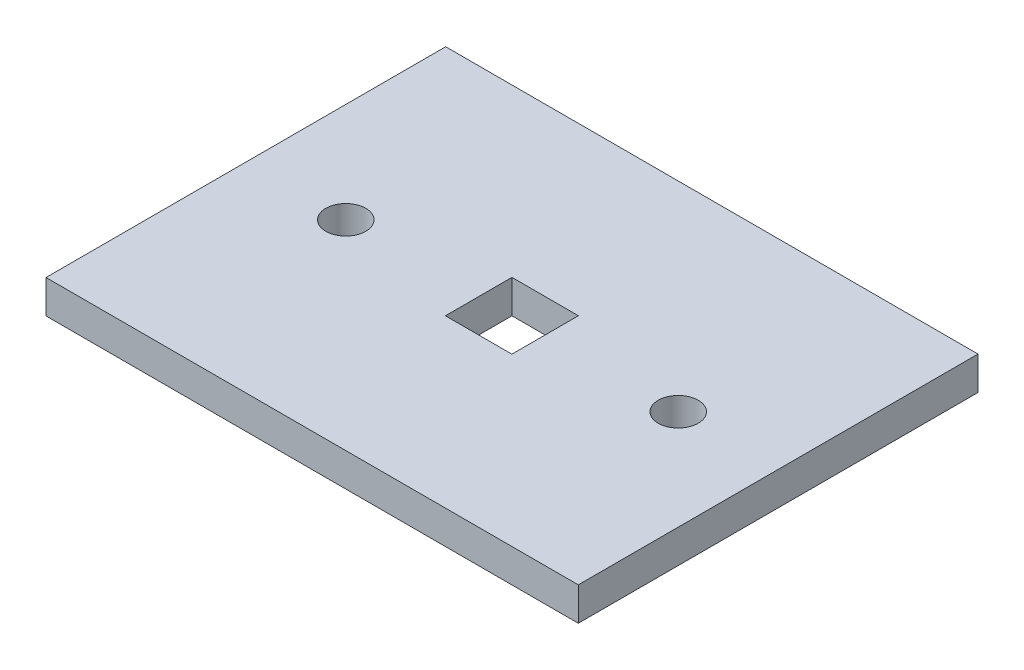
ISO-10303-21;
HEADER;
FILE_DESCRIPTION(('STEP AP214'),'2;1');
FILE_NAME('part.step','',(''),(''),'','','');
FILE_SCHEMA(('AUTOMOTIVE_DESIGN { 1 0 10303 214 1 1 1 1 }'));
ENDSEC;
DATA;
#1=APPLICATION_CONTEXT('core data for automotive mechanical design processes');
#2=APPLICATION_PROTOCOL_DEFINITION('international standard','automotive_design',2000,#1);
#3=PRODUCT_CONTEXT('',#1,'mechanical');
#4=PRODUCT('Part','Part','',(#3));
#5=PRODUCT_RELATED_PRODUCT_CATEGORY('part','',(#4));
#6=PRODUCT_DEFINITION_FORMATION('','',#4);
#7=PRODUCT_DEFINITION_CONTEXT('part definition',#1,'design');
#8=PRODUCT_DEFINITION('design','',#6,#7);
#9=PRODUCT_DEFINITION_SHAPE('','',#8);
#10=(LENGTH_UNIT() NAMED_UNIT(*) SI_UNIT(.MILLI.,.METRE.));
#11=(NAMED_UNIT(*) PLANE_ANGLE_UNIT() SI_UNIT($,.RADIAN.));
#12=(NAMED_UNIT(*) SI_UNIT($,.STERADIAN.) SOLID_ANGLE_UNIT());
#13=UNCERTAINTY_MEASURE_WITH_UNIT(LENGTH_MEASURE(1.E-05),#10,'distance_accuracy_value','');
#14=(GEOMETRIC_REPRESENTATION_CONTEXT(3) GLOBAL_UNCERTAINTY_ASSIGNED_CONTEXT((#13)) GLOBAL_UNIT_ASSIGNED_CONTEXT((#10,
#11,#12)) REPRESENTATION_CONTEXT('',''));
#15=CARTESIAN_POINT('',(0.,0.,0.));
#16=DIRECTION('',(0.,0.,1.));
#17=DIRECTION('',(1.,0.,0.));
#18=AXIS2_PLACEMENT_3D('',#15,#16,#17);
#19=CARTESIAN_POINT('',(0.,10.,0.));
#20=DIRECTION('',(0.,1.,0.));
#21=DIRECTION('',(0.,0.,1.));
#22=AXIS2_PLACEMENT_3D('',#19,#20,#21);
#23=PLANE('',#22);
#24=CARTESIAN_POINT('',(-15.5121951219512,10.,22.2439024390244));
#25=DIRECTION('',(0.,1.,0.));
#26=DIRECTION('',(0.,0.,1.));
#27=AXIS2_PLACEMENT_3D('',#24,#25,#26);
#28=CIRCLE('',#27,6.);
#29=CARTESIAN_POINT('',(-15.5121951219512,10.,28.2439024390244));
#30=VERTEX_POINT('',#29);
#31=EDGE_CURVE('E197',#30,#30,#28,.T.);
#32=ORIENTED_EDGE('',*,*,#31,.F.);
#33=EDGE_LOOP('',(#32));
#34=FACE_BOUND('',#33,.T.);
#35=CARTESIAN_POINT('',(84.2926829268293,10.,22.2439024390244));
#36=DIRECTION('',(0.,1.,0.));
#37=DIRECTION('',(0.,0.,1.));
#38=AXIS2_PLACEMENT_3D('',#35,#36,#37);
#39=CIRCLE('',#38,6.);
#40=CARTESIAN_POINT('',(84.2926829268293,10.,28.2439024390244));
#41=VERTEX_POINT('',#40);
#42=EDGE_CURVE('E133',#41,#41,#39,.T.);
#43=ORIENTED_EDGE('',*,*,#42,.F.);
#44=EDGE_LOOP('',(#43));
#45=FACE_BOUND('',#44,.T.);
#46=DIRECTION('',(0.,0.,-1.));
#47=VECTOR('',#46,1.);
#48=CARTESIAN_POINT('',(114.292682926829,10.,82.2439024390244));
#49=LINE('',#48,#47);
#50=CARTESIAN_POINT('',(114.292682926829,10.,82.2439024390244));
#51=VERTEX_POINT('',#50);
#52=CARTESIAN_POINT('',(114.292682926829,10.,-37.7560975609756));
#53=VERTEX_POINT('',#52);
#54=EDGE_CURVE('E147',#51,#53,#49,.T.);
#55=ORIENTED_EDGE('',*,*,#54,.T.);
#56=DIRECTION('',(-1.,0.,0.));
#57=VECTOR('',#56,1.);
#58=CARTESIAN_POINT('',(114.292682926829,10.,-37.7560975609756));
#59=LINE('',#58,#57);
#60=CARTESIAN_POINT('',(-45.5121951219512,10.,-37.7560975609756));
#61=VERTEX_POINT('',#60);
#62=EDGE_CURVE('E151',#53,#61,#59,.T.);
#63=ORIENTED_EDGE('',*,*,#62,.T.);
#64=DIRECTION('',(0.,0.,1.));
#65=VECTOR('',#64,1.);
#66=CARTESIAN_POINT('',(-45.5121951219512,10.,-37.7560975609756));
#67=LINE('',#66,#65);
#68=CARTESIAN_POINT('',(-45.5121951219512,10.,82.2439024390244));
#69=VERTEX_POINT('',#68);
#70=EDGE_CURVE('E155',#61,#69,#67,.T.);
#71=ORIENTED_EDGE('',*,*,#70,.T.);
#72=DIRECTION('',(1.,0.,0.));
#73=VECTOR('',#72,1.);
#74=CARTESIAN_POINT('',(-45.5121951219512,10.,82.2439024390244));
#75=LINE('',#74,#73);
#76=EDGE_CURVE('E158',#69,#51,#75,.T.);
#77=ORIENTED_EDGE('',*,*,#76,.T.);
#78=EDGE_LOOP('',(#55,#63,#71,#77));
#79=FACE_BOUND('',#78,.T.);
#80=DIRECTION('',(1.,0.,0.));
#81=VECTOR('',#80,1.);
#82=CARTESIAN_POINT('',(24.3985211014603,10.,12.2689504171944));
#83=LINE('',#82,#81);
#84=CARTESIAN_POINT('',(24.3985211014603,10.,12.2689504171944));
#85=VERTEX_POINT('',#84);
#86=CARTESIAN_POINT('',(44.3572703536574,10.,12.2689504171944));
#87=VERTEX_POINT('',#86);
#88=EDGE_CURVE('E126',#85,#87,#83,.T.);
#89=ORIENTED_EDGE('',*,*,#88,.T.);
#90=DIRECTION('',(0.,0.,1.));
#91=VECTOR('',#90,1.);
#92=CARTESIAN_POINT('',(44.3572703536574,10.,22.2439024390244));
#93=LINE('',#92,#91);
#94=CARTESIAN_POINT('',(44.3572703536574,10.,32.248924449334));
#95=VERTEX_POINT('',#94);
#96=EDGE_CURVE('E57',#87,#95,#93,.T.);
#97=ORIENTED_EDGE('',*,*,#96,.T.);
#98=DIRECTION('',(-1.,0.,0.));
#99=VECTOR('',#98,1.);
#100=CARTESIAN_POINT('',(44.3572703536574,10.,32.248924449334));
#101=LINE('',#100,#99);
#102=CARTESIAN_POINT('',(24.3985211014603,10.,32.248924449334));
#103=VERTEX_POINT('',#102);
#104=EDGE_CURVE('E116',#95,#103,#101,.T.);
#105=ORIENTED_EDGE('',*,*,#104,.T.);
#106=DIRECTION('',(0.,0.,-1.));
#107=VECTOR('',#106,1.);
#108=CARTESIAN_POINT('',(24.3985211014603,10.,32.248924449334));
#109=LINE('',#108,#107);
#110=EDGE_CURVE('E123',#103,#85,#109,.T.);
#111=ORIENTED_EDGE('',*,*,#110,.T.);
#112=EDGE_LOOP('',(#89,#97,#105,#111));
#113=FACE_BOUND('',#112,.T.);
#114=ADVANCED_FACE('F39',(#34,#45,#79,#113),#23,.T.);
#115=CARTESIAN_POINT('',(0.,0.,0.));
#116=DIRECTION('',(0.,1.,0.));
#117=DIRECTION('',(0.,0.,1.));
#118=AXIS2_PLACEMENT_3D('',#115,#116,#117);
#119=PLANE('',#118);
#120=CARTESIAN_POINT('',(-15.5121951219512,0.,22.2439024390244));
#121=DIRECTION('',(0.,1.,0.));
#122=DIRECTION('',(0.,0.,1.));
#123=AXIS2_PLACEMENT_3D('',#120,#121,#122);
#124=CIRCLE('',#123,6.);
#125=CARTESIAN_POINT('',(-15.5121951219512,0.,28.2439024390244));
#126=VERTEX_POINT('',#125);
#127=EDGE_CURVE('E43',#126,#126,#124,.T.);
#128=ORIENTED_EDGE('',*,*,#127,.T.);
#129=EDGE_LOOP('',(#128));
#130=FACE_BOUND('',#129,.T.);
#131=CARTESIAN_POINT('',(84.2926829268293,0.,22.2439024390244));
#132=DIRECTION('',(0.,1.,0.));
#133=DIRECTION('',(0.,0.,1.));
#134=AXIS2_PLACEMENT_3D('',#131,#132,#133);
#135=CIRCLE('',#134,6.);
#136=CARTESIAN_POINT('',(84.2926829268293,0.,28.2439024390244));
#137=VERTEX_POINT('',#136);
#138=EDGE_CURVE('E131',#137,#137,#135,.T.);
#139=ORIENTED_EDGE('',*,*,#138,.T.);
#140=EDGE_LOOP('',(#139));
#141=FACE_BOUND('',#140,.T.);
#142=DIRECTION('',(0.,0.,-1.));
#143=VECTOR('',#142,1.);
#144=CARTESIAN_POINT('',(114.292682926829,0.,82.2439024390244));
#145=LINE('',#144,#143);
#146=CARTESIAN_POINT('',(114.292682926829,0.,82.2439024390244));
#147=VERTEX_POINT('',#146);
#148=CARTESIAN_POINT('',(114.292682926829,0.,-37.7560975609756));
#149=VERTEX_POINT('',#148);
#150=EDGE_CURVE('E112',#147,#149,#145,.T.);
#151=ORIENTED_EDGE('',*,*,#150,.F.);
#152=DIRECTION('',(1.,0.,0.));
#153=VECTOR('',#152,1.);
#154=CARTESIAN_POINT('',(-45.5121951219512,0.,82.2439024390244));
#155=LINE('',#154,#153);
#156=CARTESIAN_POINT('',(-45.5121951219512,0.,82.2439024390244));
#157=VERTEX_POINT('',#156);
#158=EDGE_CURVE('E152',#157,#147,#155,.T.);
#159=ORIENTED_EDGE('',*,*,#158,.F.);
#160=DIRECTION('',(0.,0.,1.));
#161=VECTOR('',#160,1.);
#162=CARTESIAN_POINT('',(-45.5121951219512,0.,-37.7560975609756));
#163=LINE('',#162,#161);
#164=CARTESIAN_POINT('',(-45.5121951219512,0.,-37.7560975609756));
#165=VERTEX_POINT('',#164);
#166=EDGE_CURVE('E168',#165,#157,#163,.T.);
#167=ORIENTED_EDGE('',*,*,#166,.F.);
#168=DIRECTION('',(-1.,0.,0.));
#169=VECTOR('',#168,1.);
#170=CARTESIAN_POINT('',(114.292682926829,0.,-37.7560975609756));
#171=LINE('',#170,#169);
#172=EDGE_CURVE('E165',#149,#165,#171,.T.);
#173=ORIENTED_EDGE('',*,*,#172,.F.);
#174=EDGE_LOOP('',(#151,#159,#167,#173));
#175=FACE_BOUND('',#174,.T.);
#176=DIRECTION('',(0.,0.,1.));
#177=VECTOR('',#176,1.);
#178=CARTESIAN_POINT('',(44.3572703536574,0.,0.));
#179=LINE('',#178,#177);
#180=CARTESIAN_POINT('',(44.3572703536574,0.,12.2689504171944));
#181=VERTEX_POINT('',#180);
#182=CARTESIAN_POINT('',(44.3572703536574,0.,32.248924449334));
#183=VERTEX_POINT('',#182);
#184=EDGE_CURVE('E11',#181,#183,#179,.T.);
#185=ORIENTED_EDGE('',*,*,#184,.F.);
#186=DIRECTION('',(1.,0.,0.));
#187=VECTOR('',#186,1.);
#188=CARTESIAN_POINT('',(0.,0.,12.2689504171944));
#189=LINE('',#188,#187);
#190=CARTESIAN_POINT('',(24.3985211014603,0.,12.2689504171944));
#191=VERTEX_POINT('',#190);
#192=EDGE_CURVE('E188',#191,#181,#189,.T.);
#193=ORIENTED_EDGE('',*,*,#192,.F.);
#194=DIRECTION('',(0.,0.,-1.));
#195=VECTOR('',#194,1.);
#196=CARTESIAN_POINT('',(24.3985211014603,0.,0.));
#197=LINE('',#196,#195);
#198=CARTESIAN_POINT('',(24.3985211014603,0.,32.248924449334));
#199=VERTEX_POINT('',#198);
#200=EDGE_CURVE('E191',#199,#191,#197,.T.);
#201=ORIENTED_EDGE('',*,*,#200,.F.);
#202=DIRECTION('',(-1.,0.,0.));
#203=VECTOR('',#202,1.);
#204=CARTESIAN_POINT('',(0.,0.,32.248924449334));
#205=LINE('',#204,#203);
#206=EDGE_CURVE('E49',#183,#199,#205,.T.);
#207=ORIENTED_EDGE('',*,*,#206,.F.);
#208=EDGE_LOOP('',(#185,#193,#201,#207));
#209=FACE_BOUND('',#208,.T.);
#210=ADVANCED_FACE('F213',(#130,#141,#175,#209),#119,.F.);
#211=CARTESIAN_POINT('',(114.292682926829,10.,82.2439024390244));
#212=DIRECTION('',(-1.,0.,0.));
#213=DIRECTION('',(0.,0.,1.));
#214=AXIS2_PLACEMENT_3D('',#211,#212,#213);
#215=PLANE('',#214);
#216=ORIENTED_EDGE('',*,*,#150,.T.);
#217=DIRECTION('',(0.,-1.,0.));
#218=VECTOR('',#217,1.);
#219=CARTESIAN_POINT('',(114.292682926829,10.,-37.7560975609756));
#220=LINE('',#219,#218);
#221=EDGE_CURVE('E184',#53,#149,#220,.T.);
#222=ORIENTED_EDGE('',*,*,#221,.F.);
#223=ORIENTED_EDGE('',*,*,#54,.F.);
#224=DIRECTION('',(0.,-1.,0.));
#225=VECTOR('',#224,1.);
#226=CARTESIAN_POINT('',(114.292682926829,10.,82.2439024390244));
#227=LINE('',#226,#225);
#228=EDGE_CURVE('E161',#51,#147,#227,.T.);
#229=ORIENTED_EDGE('',*,*,#228,.T.);
#230=EDGE_LOOP('',(#216,#222,#223,#229));
#231=FACE_BOUND('',#230,.T.);
#232=ADVANCED_FACE('F41',(#231),#215,.F.);
#233=CARTESIAN_POINT('',(114.292682926829,10.,-37.7560975609756));
#234=DIRECTION('',(0.,0.,1.));
#235=DIRECTION('',(1.,0.,0.));
#236=AXIS2_PLACEMENT_3D('',#233,#234,#235);
#237=PLANE('',#236);
#238=ORIENTED_EDGE('',*,*,#172,.T.);
#239=DIRECTION('',(0.,-1.,0.));
#240=VECTOR('',#239,1.);
#241=CARTESIAN_POINT('',(-45.5121951219512,10.,-37.7560975609756));
#242=LINE('',#241,#240);
#243=EDGE_CURVE('E180',#61,#165,#242,.T.);
#244=ORIENTED_EDGE('',*,*,#243,.F.);
#245=ORIENTED_EDGE('',*,*,#62,.F.);
#246=ORIENTED_EDGE('',*,*,#221,.T.);
#247=EDGE_LOOP('',(#238,#244,#245,#246));
#248=FACE_BOUND('',#247,.T.);
#249=ADVANCED_FACE('F224',(#248),#237,.F.);
#250=CARTESIAN_POINT('',(-45.5121951219512,10.,-37.7560975609756));
#251=DIRECTION('',(1.,0.,0.));
#252=DIRECTION('',(0.,0.,-1.));
#253=AXIS2_PLACEMENT_3D('',#250,#251,#252);
#254=PLANE('',#253);
#255=ORIENTED_EDGE('',*,*,#166,.T.);
#256=DIRECTION('',(0.,-1.,0.));
#257=VECTOR('',#256,1.);
#258=CARTESIAN_POINT('',(-45.5121951219512,10.,82.2439024390244));
#259=LINE('',#258,#257);
#260=EDGE_CURVE('E176',#69,#157,#259,.T.);
#261=ORIENTED_EDGE('',*,*,#260,.F.);
#262=ORIENTED_EDGE('',*,*,#70,.F.);
#263=ORIENTED_EDGE('',*,*,#243,.T.);
#264=EDGE_LOOP('',(#255,#261,#262,#263));
#265=FACE_BOUND('',#264,.T.);
#266=ADVANCED_FACE('F229',(#265),#254,.F.);
#267=CARTESIAN_POINT('',(-45.5121951219512,10.,82.2439024390244));
#268=DIRECTION('',(0.,0.,-1.));
#269=DIRECTION('',(-1.,0.,0.));
#270=AXIS2_PLACEMENT_3D('',#267,#268,#269);
#271=PLANE('',#270);
#272=ORIENTED_EDGE('',*,*,#158,.T.);
#273=ORIENTED_EDGE('',*,*,#228,.F.);
#274=ORIENTED_EDGE('',*,*,#76,.F.);
#275=ORIENTED_EDGE('',*,*,#260,.T.);
#276=EDGE_LOOP('',(#272,#273,#274,#275));
#277=FACE_BOUND('',#276,.T.);
#278=ADVANCED_FACE('F232',(#277),#271,.F.);
#279=CARTESIAN_POINT('',(44.3572703536574,-10.,22.2439024390244));
#280=DIRECTION('',(-1.,0.,0.));
#281=DIRECTION('',(0.,0.,1.));
#282=AXIS2_PLACEMENT_3D('',#279,#280,#281);
#283=PLANE('',#282);
#284=ORIENTED_EDGE('',*,*,#184,.T.);
#285=DIRECTION('',(0.,1.,0.));
#286=VECTOR('',#285,1.);
#287=CARTESIAN_POINT('',(44.3572703536574,-10.,32.248924449334));
#288=LINE('',#287,#286);
#289=EDGE_CURVE('E105',#183,#95,#288,.T.);
#290=ORIENTED_EDGE('',*,*,#289,.T.);
#291=ORIENTED_EDGE('',*,*,#96,.F.);
#292=DIRECTION('',(0.,1.,0.));
#293=VECTOR('',#292,1.);
#294=CARTESIAN_POINT('',(44.3572703536574,-10.,12.2689504171944));
#295=LINE('',#294,#293);
#296=EDGE_CURVE('E140',#181,#87,#295,.T.);
#297=ORIENTED_EDGE('',*,*,#296,.F.);
#298=EDGE_LOOP('',(#284,#290,#291,#297));
#299=FACE_BOUND('',#298,.T.);
#300=ADVANCED_FACE('F107',(#299),#283,.T.);
#301=CARTESIAN_POINT('',(44.3572703536574,-10.,32.248924449334));
#302=DIRECTION('',(0.,0.,-1.));
#303=DIRECTION('',(-1.,0.,0.));
#304=AXIS2_PLACEMENT_3D('',#301,#302,#303);
#305=PLANE('',#304);
#306=ORIENTED_EDGE('',*,*,#206,.T.);
#307=DIRECTION('',(0.,1.,0.));
#308=VECTOR('',#307,1.);
#309=CARTESIAN_POINT('',(24.3985211014603,-10.,32.248924449334));
#310=LINE('',#309,#308);
#311=EDGE_CURVE('E113',#199,#103,#310,.T.);
#312=ORIENTED_EDGE('',*,*,#311,.T.);
#313=ORIENTED_EDGE('',*,*,#104,.F.);
#314=ORIENTED_EDGE('',*,*,#289,.F.);
#315=EDGE_LOOP('',(#306,#312,#313,#314));
#316=FACE_BOUND('',#315,.T.);
#317=ADVANCED_FACE('F117',(#316),#305,.T.);
#318=CARTESIAN_POINT('',(24.3985211014603,-10.,32.248924449334));
#319=DIRECTION('',(1.,0.,0.));
#320=DIRECTION('',(0.,0.,-1.));
#321=AXIS2_PLACEMENT_3D('',#318,#319,#320);
#322=PLANE('',#321);
#323=ORIENTED_EDGE('',*,*,#200,.T.);
#324=DIRECTION('',(0.,1.,0.));
#325=VECTOR('',#324,1.);
#326=CARTESIAN_POINT('',(24.3985211014603,-10.,12.2689504171944));
#327=LINE('',#326,#325);
#328=EDGE_CURVE('E65',#191,#85,#327,.T.);
#329=ORIENTED_EDGE('',*,*,#328,.T.);
#330=ORIENTED_EDGE('',*,*,#110,.F.);
#331=ORIENTED_EDGE('',*,*,#311,.F.);
#332=EDGE_LOOP('',(#323,#329,#330,#331));
#333=FACE_BOUND('',#332,.T.);
#334=ADVANCED_FACE('F241',(#333),#322,.T.);
#335=CARTESIAN_POINT('',(24.3985211014603,-10.,12.2689504171944));
#336=DIRECTION('',(0.,0.,1.));
#337=DIRECTION('',(1.,0.,0.));
#338=AXIS2_PLACEMENT_3D('',#335,#336,#337);
#339=PLANE('',#338);
#340=ORIENTED_EDGE('',*,*,#192,.T.);
#341=ORIENTED_EDGE('',*,*,#296,.T.);
#342=ORIENTED_EDGE('',*,*,#88,.F.);
#343=ORIENTED_EDGE('',*,*,#328,.F.);
#344=EDGE_LOOP('',(#340,#341,#342,#343));
#345=FACE_BOUND('',#344,.T.);
#346=ADVANCED_FACE('F242',(#345),#339,.T.);
#347=CARTESIAN_POINT('',(84.2926829268293,-10.,22.2439024390244));
#348=DIRECTION('',(0.,1.,0.));
#349=DIRECTION('',(0.,0.,1.));
#350=AXIS2_PLACEMENT_3D('',#347,#348,#349);
#351=CYLINDRICAL_SURFACE('',#350,6.);
#352=ORIENTED_EDGE('',*,*,#42,.T.);
#353=EDGE_LOOP('',(#352));
#354=FACE_BOUND('',#353,.T.);
#355=ORIENTED_EDGE('',*,*,#138,.F.);
#356=EDGE_LOOP('',(#355));
#357=FACE_BOUND('',#356,.T.);
#358=ADVANCED_FACE('F208',(#354,#357),#351,.F.);
#359=CARTESIAN_POINT('',(-15.5121951219512,-10.,22.2439024390244));
#360=DIRECTION('',(0.,1.,0.));
#361=DIRECTION('',(0.,0.,1.));
#362=AXIS2_PLACEMENT_3D('',#359,#360,#361);
#363=CYLINDRICAL_SURFACE('',#362,6.);
#364=ORIENTED_EDGE('',*,*,#31,.T.);
#365=EDGE_LOOP('',(#364));
#366=FACE_BOUND('',#365,.T.);
#367=ORIENTED_EDGE('',*,*,#127,.F.);
#368=EDGE_LOOP('',(#367));
#369=FACE_BOUND('',#368,.T.);
#370=ADVANCED_FACE('F249',(#366,#369),#363,.F.);
#371=CLOSED_SHELL('',(#114,#210,#232,#249,#266,#278,#300,#317,#334,#346,#358,#370));
#372=MANIFOLD_SOLID_BREP('B2',#371);
#373=ADVANCED_BREP_SHAPE_REPRESENTATION('',(#18,#372),#14);
#374=SHAPE_DEFINITION_REPRESENTATION(#9,#373);
ENDSEC;
END-ISO-10303-21;
